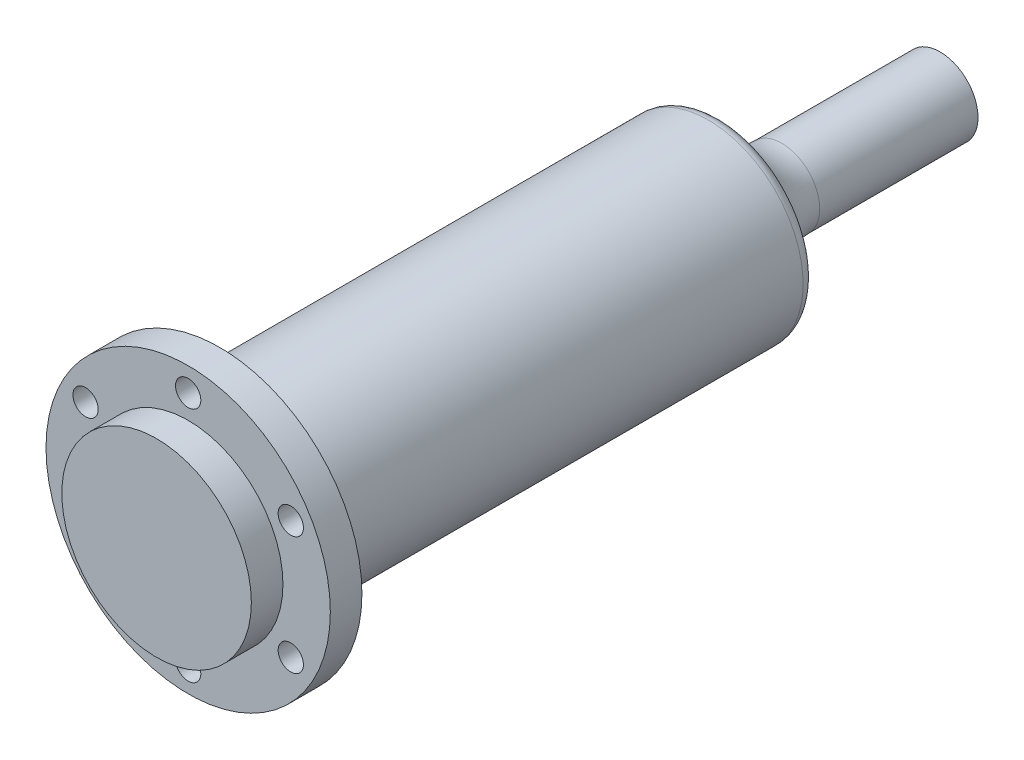
ISO-10303-21;
HEADER;
FILE_DESCRIPTION(('STEP AP214'),'2;1');
FILE_NAME('part.step','',(''),(''),'','','');
FILE_SCHEMA(('AUTOMOTIVE_DESIGN { 1 0 10303 214 1 1 1 1 }'));
ENDSEC;
DATA;
#1=APPLICATION_CONTEXT('core data for automotive mechanical design processes');
#2=APPLICATION_PROTOCOL_DEFINITION('international standard','automotive_design',2000,#1);
#3=PRODUCT_CONTEXT('',#1,'mechanical');
#4=PRODUCT('Part','Part','',(#3));
#5=PRODUCT_RELATED_PRODUCT_CATEGORY('part','',(#4));
#6=PRODUCT_DEFINITION_FORMATION('','',#4);
#7=PRODUCT_DEFINITION_CONTEXT('part definition',#1,'design');
#8=PRODUCT_DEFINITION('design','',#6,#7);
#9=PRODUCT_DEFINITION_SHAPE('','',#8);
#10=(LENGTH_UNIT() NAMED_UNIT(*) SI_UNIT(.MILLI.,.METRE.));
#11=(NAMED_UNIT(*) PLANE_ANGLE_UNIT() SI_UNIT($,.RADIAN.));
#12=(NAMED_UNIT(*) SI_UNIT($,.STERADIAN.) SOLID_ANGLE_UNIT());
#13=UNCERTAINTY_MEASURE_WITH_UNIT(LENGTH_MEASURE(1.E-05),#10,'distance_accuracy_value','');
#14=(GEOMETRIC_REPRESENTATION_CONTEXT(3) GLOBAL_UNCERTAINTY_ASSIGNED_CONTEXT((#13)) GLOBAL_UNIT_ASSIGNED_CONTEXT((#10,
#11,#12)) REPRESENTATION_CONTEXT('',''));
#15=CARTESIAN_POINT('',(0.,0.,0.));
#16=DIRECTION('',(0.,0.,1.));
#17=DIRECTION('',(1.,0.,0.));
#18=AXIS2_PLACEMENT_3D('',#15,#16,#17);
#19=CARTESIAN_POINT('',(0.,0.,72.));
#20=DIRECTION('',(0.,0.,-1.));
#21=DIRECTION('',(-1.,0.,0.));
#22=AXIS2_PLACEMENT_3D('',#19,#20,#21);
#23=CYLINDRICAL_SURFACE('',#22,15.);
#24=CARTESIAN_POINT('',(0.,0.,84.));
#25=DIRECTION('',(0.,0.,1.));
#26=DIRECTION('',(1.,0.,0.));
#27=AXIS2_PLACEMENT_3D('',#24,#25,#26);
#28=CIRCLE('',#27,15.);
#29=CARTESIAN_POINT('',(15.,0.,84.));
#30=VERTEX_POINT('',#29);
#31=EDGE_CURVE('E54',#30,#30,#28,.T.);
#32=ORIENTED_EDGE('',*,*,#31,.T.);
#33=EDGE_LOOP('',(#32));
#34=FACE_BOUND('',#33,.T.);
#35=CARTESIAN_POINT('',(0.,0.,89.));
#36=DIRECTION('',(0.,0.,1.));
#37=DIRECTION('',(1.,0.,0.));
#38=AXIS2_PLACEMENT_3D('',#35,#36,#37);
#39=CIRCLE('',#38,15.);
#40=CARTESIAN_POINT('',(15.,0.,89.));
#41=VERTEX_POINT('',#40);
#42=EDGE_CURVE('E53',#41,#41,#39,.T.);
#43=ORIENTED_EDGE('',*,*,#42,.F.);
#44=EDGE_LOOP('',(#43));
#45=FACE_BOUND('',#44,.T.);
#46=ADVANCED_FACE('F33',(#34,#45),#23,.T.);
#47=CARTESIAN_POINT('',(0.,0.,89.));
#48=DIRECTION('',(0.,0.,1.));
#49=DIRECTION('',(1.,0.,0.));
#50=AXIS2_PLACEMENT_3D('',#47,#48,#49);
#51=PLANE('',#50);
#52=ORIENTED_EDGE('',*,*,#42,.T.);
#53=EDGE_LOOP('',(#52));
#54=FACE_BOUND('',#53,.T.);
#55=ADVANCED_FACE('F129',(#54),#51,.T.);
#56=CARTESIAN_POINT('',(0.,0.,79.));
#57=DIRECTION('',(0.,0.,1.));
#58=DIRECTION('',(1.,0.,0.));
#59=AXIS2_PLACEMENT_3D('',#56,#57,#58);
#60=CYLINDRICAL_SURFACE('',#59,22.5);
#61=CARTESIAN_POINT('',(0.,0.,79.));
#62=DIRECTION('',(0.,0.,1.));
#63=DIRECTION('',(1.,0.,0.));
#64=AXIS2_PLACEMENT_3D('',#61,#62,#63);
#65=CIRCLE('',#64,22.5);
#66=CARTESIAN_POINT('',(22.5,0.,79.));
#67=VERTEX_POINT('',#66);
#68=EDGE_CURVE('E57',#67,#67,#65,.T.);
#69=ORIENTED_EDGE('',*,*,#68,.T.);
#70=EDGE_LOOP('',(#69));
#71=FACE_BOUND('',#70,.T.);
#72=CARTESIAN_POINT('',(0.,0.,84.));
#73=DIRECTION('',(0.,0.,1.));
#74=DIRECTION('',(1.,0.,0.));
#75=AXIS2_PLACEMENT_3D('',#72,#73,#74);
#76=CIRCLE('',#75,22.5);
#77=CARTESIAN_POINT('',(22.5,0.,84.));
#78=VERTEX_POINT('',#77);
#79=EDGE_CURVE('E60',#78,#78,#76,.T.);
#80=ORIENTED_EDGE('',*,*,#79,.F.);
#81=EDGE_LOOP('',(#80));
#82=FACE_BOUND('',#81,.T.);
#83=ADVANCED_FACE('F136',(#71,#82),#60,.T.);
#84=CARTESIAN_POINT('',(0.,0.,79.));
#85=DIRECTION('',(0.,0.,1.));
#86=DIRECTION('',(1.,0.,0.));
#87=AXIS2_PLACEMENT_3D('',#84,#85,#86);
#88=PLANE('',#87);
#89=CARTESIAN_POINT('',(0.,0.,79.));
#90=DIRECTION('',(0.,0.,1.));
#91=DIRECTION('',(1.,0.,0.));
#92=AXIS2_PLACEMENT_3D('',#89,#90,#91);
#93=CIRCLE('',#92,15.);
#94=CARTESIAN_POINT('',(15.,0.,79.));
#95=VERTEX_POINT('',#94);
#96=EDGE_CURVE('E48',#95,#95,#93,.T.);
#97=ORIENTED_EDGE('',*,*,#96,.T.);
#98=EDGE_LOOP('',(#97));
#99=FACE_BOUND('',#98,.T.);
#100=CARTESIAN_POINT('',(-16.2379763209579,9.37499999999936,79.));
#101=DIRECTION('',(0.,0.,1.));
#102=DIRECTION('',(1.,0.,0.));
#103=AXIS2_PLACEMENT_3D('',#100,#101,#102);
#104=CIRCLE('',#103,2.);
#105=CARTESIAN_POINT('',(-14.2379763209579,9.37499999999936,79.));
#106=VERTEX_POINT('',#105);
#107=EDGE_CURVE('E93',#106,#106,#104,.T.);
#108=ORIENTED_EDGE('',*,*,#107,.T.);
#109=EDGE_LOOP('',(#108));
#110=FACE_BOUND('',#109,.T.);
#111=CARTESIAN_POINT('',(-16.2379763209571,-9.37500000000063,79.));
#112=DIRECTION('',(0.,0.,1.));
#113=DIRECTION('',(1.,0.,0.));
#114=AXIS2_PLACEMENT_3D('',#111,#112,#113);
#115=CIRCLE('',#114,2.);
#116=CARTESIAN_POINT('',(-14.2379763209571,-9.37500000000063,79.));
#117=VERTEX_POINT('',#116);
#118=EDGE_CURVE('E87',#117,#117,#115,.T.);
#119=ORIENTED_EDGE('',*,*,#118,.T.);
#120=EDGE_LOOP('',(#119));
#121=FACE_BOUND('',#120,.T.);
#122=CARTESIAN_POINT('',(1.4434757954648E-12,-18.75,79.));
#123=DIRECTION('',(0.,0.,1.));
#124=DIRECTION('',(1.,0.,0.));
#125=AXIS2_PLACEMENT_3D('',#122,#123,#124);
#126=CIRCLE('',#125,2.);
#127=CARTESIAN_POINT('',(2.00000000000144,-18.75,79.));
#128=VERTEX_POINT('',#127);
#129=EDGE_CURVE('E81',#128,#128,#126,.T.);
#130=ORIENTED_EDGE('',*,*,#129,.T.);
#131=EDGE_LOOP('',(#130));
#132=FACE_BOUND('',#131,.T.);
#133=CARTESIAN_POINT('',(16.2379763209593,-9.37499999999937,79.));
#134=DIRECTION('',(0.,0.,1.));
#135=DIRECTION('',(1.,0.,0.));
#136=AXIS2_PLACEMENT_3D('',#133,#134,#135);
#137=CIRCLE('',#136,2.);
#138=CARTESIAN_POINT('',(18.2379763209593,-9.37499999999937,79.));
#139=VERTEX_POINT('',#138);
#140=EDGE_CURVE('E75',#139,#139,#137,.T.);
#141=ORIENTED_EDGE('',*,*,#140,.T.);
#142=EDGE_LOOP('',(#141));
#143=FACE_BOUND('',#142,.T.);
#144=CARTESIAN_POINT('',(16.2379763209586,9.37500000000063,79.));
#145=DIRECTION('',(0.,0.,1.));
#146=DIRECTION('',(1.,0.,0.));
#147=AXIS2_PLACEMENT_3D('',#144,#145,#146);
#148=CIRCLE('',#147,2.);
#149=CARTESIAN_POINT('',(18.2379763209586,9.37500000000063,79.));
#150=VERTEX_POINT('',#149);
#151=EDGE_CURVE('E69',#150,#150,#148,.T.);
#152=ORIENTED_EDGE('',*,*,#151,.T.);
#153=EDGE_LOOP('',(#152));
#154=FACE_BOUND('',#153,.T.);
#155=CARTESIAN_POINT('',(0.,18.75,79.));
#156=DIRECTION('',(0.,0.,1.));
#157=DIRECTION('',(1.,0.,0.));
#158=AXIS2_PLACEMENT_3D('',#155,#156,#157);
#159=CIRCLE('',#158,2.);
#160=CARTESIAN_POINT('',(2.,18.75,79.));
#161=VERTEX_POINT('',#160);
#162=EDGE_CURVE('E63',#161,#161,#159,.T.);
#163=ORIENTED_EDGE('',*,*,#162,.T.);
#164=EDGE_LOOP('',(#163));
#165=FACE_BOUND('',#164,.T.);
#166=ORIENTED_EDGE('',*,*,#68,.F.);
#167=EDGE_LOOP('',(#166));
#168=FACE_BOUND('',#167,.T.);
#169=ADVANCED_FACE('F153',(#99,#110,#121,#132,#143,#154,#165,#168),#88,.F.);
#170=CARTESIAN_POINT('',(0.,0.,84.));
#171=DIRECTION('',(0.,0.,1.));
#172=DIRECTION('',(1.,0.,0.));
#173=AXIS2_PLACEMENT_3D('',#170,#171,#172);
#174=PLANE('',#173);
#175=ORIENTED_EDGE('',*,*,#31,.F.);
#176=EDGE_LOOP('',(#175));
#177=FACE_BOUND('',#176,.T.);
#178=CARTESIAN_POINT('',(-16.2379763209579,9.37499999999936,84.));
#179=DIRECTION('',(0.,0.,1.));
#180=DIRECTION('',(1.,0.,0.));
#181=AXIS2_PLACEMENT_3D('',#178,#179,#180);
#182=CIRCLE('',#181,2.);
#183=CARTESIAN_POINT('',(-14.2379763209579,9.37499999999936,84.));
#184=VERTEX_POINT('',#183);
#185=EDGE_CURVE('E96',#184,#184,#182,.T.);
#186=ORIENTED_EDGE('',*,*,#185,.F.);
#187=EDGE_LOOP('',(#186));
#188=FACE_BOUND('',#187,.T.);
#189=CARTESIAN_POINT('',(-16.2379763209571,-9.37500000000063,84.));
#190=DIRECTION('',(0.,0.,1.));
#191=DIRECTION('',(1.,0.,0.));
#192=AXIS2_PLACEMENT_3D('',#189,#190,#191);
#193=CIRCLE('',#192,2.);
#194=CARTESIAN_POINT('',(-14.2379763209571,-9.37500000000063,84.));
#195=VERTEX_POINT('',#194);
#196=EDGE_CURVE('E90',#195,#195,#193,.T.);
#197=ORIENTED_EDGE('',*,*,#196,.F.);
#198=EDGE_LOOP('',(#197));
#199=FACE_BOUND('',#198,.T.);
#200=CARTESIAN_POINT('',(1.4434757954648E-12,-18.75,84.));
#201=DIRECTION('',(0.,0.,1.));
#202=DIRECTION('',(1.,0.,0.));
#203=AXIS2_PLACEMENT_3D('',#200,#201,#202);
#204=CIRCLE('',#203,2.);
#205=CARTESIAN_POINT('',(2.00000000000144,-18.75,84.));
#206=VERTEX_POINT('',#205);
#207=EDGE_CURVE('E84',#206,#206,#204,.T.);
#208=ORIENTED_EDGE('',*,*,#207,.F.);
#209=EDGE_LOOP('',(#208));
#210=FACE_BOUND('',#209,.T.);
#211=CARTESIAN_POINT('',(16.2379763209593,-9.37499999999937,84.));
#212=DIRECTION('',(0.,0.,1.));
#213=DIRECTION('',(1.,0.,0.));
#214=AXIS2_PLACEMENT_3D('',#211,#212,#213);
#215=CIRCLE('',#214,2.);
#216=CARTESIAN_POINT('',(18.2379763209593,-9.37499999999937,84.));
#217=VERTEX_POINT('',#216);
#218=EDGE_CURVE('E78',#217,#217,#215,.T.);
#219=ORIENTED_EDGE('',*,*,#218,.F.);
#220=EDGE_LOOP('',(#219));
#221=FACE_BOUND('',#220,.T.);
#222=CARTESIAN_POINT('',(16.2379763209586,9.37500000000063,84.));
#223=DIRECTION('',(0.,0.,1.));
#224=DIRECTION('',(1.,0.,0.));
#225=AXIS2_PLACEMENT_3D('',#222,#223,#224);
#226=CIRCLE('',#225,2.);
#227=CARTESIAN_POINT('',(18.2379763209586,9.37500000000063,84.));
#228=VERTEX_POINT('',#227);
#229=EDGE_CURVE('E72',#228,#228,#226,.T.);
#230=ORIENTED_EDGE('',*,*,#229,.F.);
#231=EDGE_LOOP('',(#230));
#232=FACE_BOUND('',#231,.T.);
#233=CARTESIAN_POINT('',(0.,18.75,84.));
#234=DIRECTION('',(0.,0.,1.));
#235=DIRECTION('',(1.,0.,0.));
#236=AXIS2_PLACEMENT_3D('',#233,#234,#235);
#237=CIRCLE('',#236,2.);
#238=CARTESIAN_POINT('',(2.,18.75,84.));
#239=VERTEX_POINT('',#238);
#240=EDGE_CURVE('E66',#239,#239,#237,.T.);
#241=ORIENTED_EDGE('',*,*,#240,.F.);
#242=EDGE_LOOP('',(#241));
#243=FACE_BOUND('',#242,.T.);
#244=ORIENTED_EDGE('',*,*,#79,.T.);
#245=EDGE_LOOP('',(#244));
#246=FACE_BOUND('',#245,.T.);
#247=ADVANCED_FACE('F156',(#177,#188,#199,#210,#221,#232,#243,#246),#174,.T.);
#248=CARTESIAN_POINT('',(0.,18.75,79.));
#249=DIRECTION('',(0.,0.,1.));
#250=DIRECTION('',(1.,0.,0.));
#251=AXIS2_PLACEMENT_3D('',#248,#249,#250);
#252=CYLINDRICAL_SURFACE('',#251,2.);
#253=ORIENTED_EDGE('',*,*,#162,.F.);
#254=EDGE_LOOP('',(#253));
#255=FACE_BOUND('',#254,.T.);
#256=ORIENTED_EDGE('',*,*,#240,.T.);
#257=EDGE_LOOP('',(#256));
#258=FACE_BOUND('',#257,.T.);
#259=ADVANCED_FACE('F178',(#255,#258),#252,.F.);
#260=CARTESIAN_POINT('',(16.2379763209586,9.37500000000063,79.));
#261=DIRECTION('',(0.,0.,1.));
#262=DIRECTION('',(1.,0.,0.));
#263=AXIS2_PLACEMENT_3D('',#260,#261,#262);
#264=CYLINDRICAL_SURFACE('',#263,2.);
#265=ORIENTED_EDGE('',*,*,#151,.F.);
#266=EDGE_LOOP('',(#265));
#267=FACE_BOUND('',#266,.T.);
#268=ORIENTED_EDGE('',*,*,#229,.T.);
#269=EDGE_LOOP('',(#268));
#270=FACE_BOUND('',#269,.T.);
#271=ADVANCED_FACE('F184',(#267,#270),#264,.F.);
#272=CARTESIAN_POINT('',(16.2379763209593,-9.37499999999937,79.));
#273=DIRECTION('',(0.,0.,1.));
#274=DIRECTION('',(1.,0.,0.));
#275=AXIS2_PLACEMENT_3D('',#272,#273,#274);
#276=CYLINDRICAL_SURFACE('',#275,2.);
#277=ORIENTED_EDGE('',*,*,#140,.F.);
#278=EDGE_LOOP('',(#277));
#279=FACE_BOUND('',#278,.T.);
#280=ORIENTED_EDGE('',*,*,#218,.T.);
#281=EDGE_LOOP('',(#280));
#282=FACE_BOUND('',#281,.T.);
#283=ADVANCED_FACE('F192',(#279,#282),#276,.F.);
#284=CARTESIAN_POINT('',(1.4434757954648E-12,-18.75,79.));
#285=DIRECTION('',(0.,0.,1.));
#286=DIRECTION('',(1.,0.,0.));
#287=AXIS2_PLACEMENT_3D('',#284,#285,#286);
#288=CYLINDRICAL_SURFACE('',#287,2.);
#289=ORIENTED_EDGE('',*,*,#129,.F.);
#290=EDGE_LOOP('',(#289));
#291=FACE_BOUND('',#290,.T.);
#292=ORIENTED_EDGE('',*,*,#207,.T.);
#293=EDGE_LOOP('',(#292));
#294=FACE_BOUND('',#293,.T.);
#295=ADVANCED_FACE('F196',(#291,#294),#288,.F.);
#296=CARTESIAN_POINT('',(-16.2379763209571,-9.37500000000063,79.));
#297=DIRECTION('',(0.,0.,1.));
#298=DIRECTION('',(1.,0.,0.));
#299=AXIS2_PLACEMENT_3D('',#296,#297,#298);
#300=CYLINDRICAL_SURFACE('',#299,2.);
#301=ORIENTED_EDGE('',*,*,#118,.F.);
#302=EDGE_LOOP('',(#301));
#303=FACE_BOUND('',#302,.T.);
#304=ORIENTED_EDGE('',*,*,#196,.T.);
#305=EDGE_LOOP('',(#304));
#306=FACE_BOUND('',#305,.T.);
#307=ADVANCED_FACE('F147',(#303,#306),#300,.F.);
#308=CARTESIAN_POINT('',(-16.2379763209579,9.37499999999936,79.));
#309=DIRECTION('',(0.,0.,1.));
#310=DIRECTION('',(1.,0.,0.));
#311=AXIS2_PLACEMENT_3D('',#308,#309,#310);
#312=CYLINDRICAL_SURFACE('',#311,2.);
#313=ORIENTED_EDGE('',*,*,#107,.F.);
#314=EDGE_LOOP('',(#313));
#315=FACE_BOUND('',#314,.T.);
#316=ORIENTED_EDGE('',*,*,#185,.T.);
#317=EDGE_LOOP('',(#316));
#318=FACE_BOUND('',#317,.T.);
#319=ADVANCED_FACE('F141',(#315,#318),#312,.F.);
#320=CARTESIAN_POINT('',(0.,0.,1.66907566755604));
#321=DIRECTION('',(0.,0.,-1.));
#322=DIRECTION('',(-1.,0.,0.));
#323=AXIS2_PLACEMENT_3D('',#320,#321,#322);
#324=CIRCLE('',#323,15.);
#325=CARTESIAN_POINT('',(-15.,0.,1.66907566755604));
#326=VERTEX_POINT('',#325);
#327=EDGE_CURVE('E40',#326,#326,#324,.F.);
#328=ORIENTED_EDGE('',*,*,#327,.T.);
#329=EDGE_LOOP('',(#328));
#330=FACE_BOUND('',#329,.T.);
#331=ORIENTED_EDGE('',*,*,#96,.F.);
#332=EDGE_LOOP('',(#331));
#333=FACE_BOUND('',#332,.T.);
#334=ADVANCED_FACE('F132',(#330,#333),#23,.T.);
#335=CARTESIAN_POINT('',(0.,0.,-35.));
#336=DIRECTION('',(0.,0.,-1.));
#337=DIRECTION('',(-1.,0.,0.));
#338=AXIS2_PLACEMENT_3D('',#335,#336,#337);
#339=PLANE('',#338);
#340=CARTESIAN_POINT('',(0.,0.,-35.));
#341=DIRECTION('',(0.,0.,-1.));
#342=DIRECTION('',(-1.,0.,0.));
#343=AXIS2_PLACEMENT_3D('',#340,#341,#342);
#344=CIRCLE('',#343,6.);
#345=CARTESIAN_POINT('',(-6.,0.,-35.));
#346=VERTEX_POINT('',#345);
#347=EDGE_CURVE('E99',#346,#346,#344,.T.);
#348=ORIENTED_EDGE('',*,*,#347,.T.);
#349=EDGE_LOOP('',(#348));
#350=FACE_BOUND('',#349,.T.);
#351=CARTESIAN_POINT('',(0.,0.,-35.));
#352=DIRECTION('',(0.,0.,-1.));
#353=DIRECTION('',(-1.,0.,0.));
#354=AXIS2_PLACEMENT_3D('',#351,#352,#353);
#355=CIRCLE('',#354,3.);
#356=CARTESIAN_POINT('',(-3.,0.,-35.));
#357=VERTEX_POINT('',#356);
#358=EDGE_CURVE('E104',#357,#357,#355,.T.);
#359=ORIENTED_EDGE('',*,*,#358,.F.);
#360=EDGE_LOOP('',(#359));
#361=FACE_BOUND('',#360,.T.);
#362=ADVANCED_FACE('F123',(#350,#361),#339,.T.);
#363=CARTESIAN_POINT('',(0.,0.,-35.));
#364=DIRECTION('',(0.,0.,1.));
#365=DIRECTION('',(1.,0.,0.));
#366=AXIS2_PLACEMENT_3D('',#363,#364,#365);
#367=CYLINDRICAL_SURFACE('',#366,6.);
#368=CARTESIAN_POINT('',(0.,0.,-9.9498743710662));
#369=DIRECTION('',(0.,0.,1.));
#370=DIRECTION('',(1.,0.,0.));
#371=AXIS2_PLACEMENT_3D('',#368,#369,#370);
#372=CIRCLE('',#371,6.);
#373=CARTESIAN_POINT('',(6.,0.,-9.9498743710662));
#374=VERTEX_POINT('',#373);
#375=EDGE_CURVE('E44',#374,#374,#372,.F.);
#376=ORIENTED_EDGE('',*,*,#375,.T.);
#377=EDGE_LOOP('',(#376));
#378=FACE_BOUND('',#377,.T.);
#379=ORIENTED_EDGE('',*,*,#347,.F.);
#380=EDGE_LOOP('',(#379));
#381=FACE_BOUND('',#380,.T.);
#382=ADVANCED_FACE('F116',(#378,#381),#367,.T.);
#383=CARTESIAN_POINT('',(0.,0.,-35.));
#384=DIRECTION('',(0.,0.,1.));
#385=DIRECTION('',(1.,0.,0.));
#386=AXIS2_PLACEMENT_3D('',#383,#384,#385);
#387=CYLINDRICAL_SURFACE('',#386,3.);
#388=ORIENTED_EDGE('',*,*,#358,.T.);
#389=EDGE_LOOP('',(#388));
#390=FACE_BOUND('',#389,.T.);
#391=CARTESIAN_POINT('',(0.,0.,5.));
#392=DIRECTION('',(0.,0.,1.));
#393=DIRECTION('',(1.,0.,0.));
#394=AXIS2_PLACEMENT_3D('',#391,#392,#393);
#395=CIRCLE('',#394,3.);
#396=CARTESIAN_POINT('',(3.,0.,5.));
#397=VERTEX_POINT('',#396);
#398=EDGE_CURVE('E107',#397,#397,#395,.F.);
#399=ORIENTED_EDGE('',*,*,#398,.F.);
#400=EDGE_LOOP('',(#399));
#401=FACE_BOUND('',#400,.T.);
#402=ADVANCED_FACE('F113',(#390,#401),#387,.F.);
#403=CARTESIAN_POINT('',(0.,0.,-9.9498743710662));
#404=DIRECTION('',(0.,0.,1.));
#405=DIRECTION('',(1.,0.,0.));
#406=AXIS2_PLACEMENT_3D('',#403,#404,#405);
#407=TOROIDAL_SURFACE('',#406,16.,10.);
#408=CARTESIAN_POINT('',(0.,0.,-0.26741600554769));
#409=DIRECTION('',(0.,0.,-1.));
#410=DIRECTION('',(-1.,0.,0.));
#411=AXIS2_PLACEMENT_3D('',#408,#409,#410);
#412=CIRCLE('',#411,13.5);
#413=CARTESIAN_POINT('',(-13.5,0.,-0.26741600554769));
#414=VERTEX_POINT('',#413);
#415=EDGE_CURVE('E11',#414,#414,#412,.T.);
#416=ORIENTED_EDGE('',*,*,#415,.T.);
#417=EDGE_LOOP('',(#416));
#418=FACE_BOUND('',#417,.T.);
#419=ORIENTED_EDGE('',*,*,#375,.F.);
#420=EDGE_LOOP('',(#419));
#421=FACE_BOUND('',#420,.T.);
#422=ADVANCED_FACE('F115',(#418,#421),#407,.F.);
#423=CARTESIAN_POINT('',(0.,0.,1.66907566755605));
#424=DIRECTION('',(0.,0.,-1.));
#425=DIRECTION('',(-1.,0.,0.));
#426=AXIS2_PLACEMENT_3D('',#423,#424,#425);
#427=TOROIDAL_SURFACE('',#426,13.,2.);
#428=ORIENTED_EDGE('',*,*,#415,.F.);
#429=EDGE_LOOP('',(#428));
#430=FACE_BOUND('',#429,.T.);
#431=ORIENTED_EDGE('',*,*,#327,.F.);
#432=EDGE_LOOP('',(#431));
#433=FACE_BOUND('',#432,.T.);
#434=ADVANCED_FACE('F35',(#430,#433),#427,.T.);
#435=CARTESIAN_POINT('',(0.,0.,5.));
#436=DIRECTION('',(0.,0.,1.));
#437=DIRECTION('',(1.,0.,0.));
#438=AXIS2_PLACEMENT_3D('',#435,#436,#437);
#439=PLANE('',#438);
#440=ORIENTED_EDGE('',*,*,#398,.T.);
#441=EDGE_LOOP('',(#440));
#442=FACE_BOUND('',#441,.T.);
#443=ADVANCED_FACE('F111',(#442),#439,.F.);
#444=CLOSED_SHELL('',(#46,#55,#83,#169,#247,#259,#271,#283,#295,#307,#319,#334,#362,#382,#402,
#422,#434,#443));
#445=MANIFOLD_SOLID_BREP('B2',#444);
#446=ADVANCED_BREP_SHAPE_REPRESENTATION('',(#18,#445),#14);
#447=SHAPE_DEFINITION_REPRESENTATION(#9,#446);
ENDSEC;
END-ISO-10303-21;
